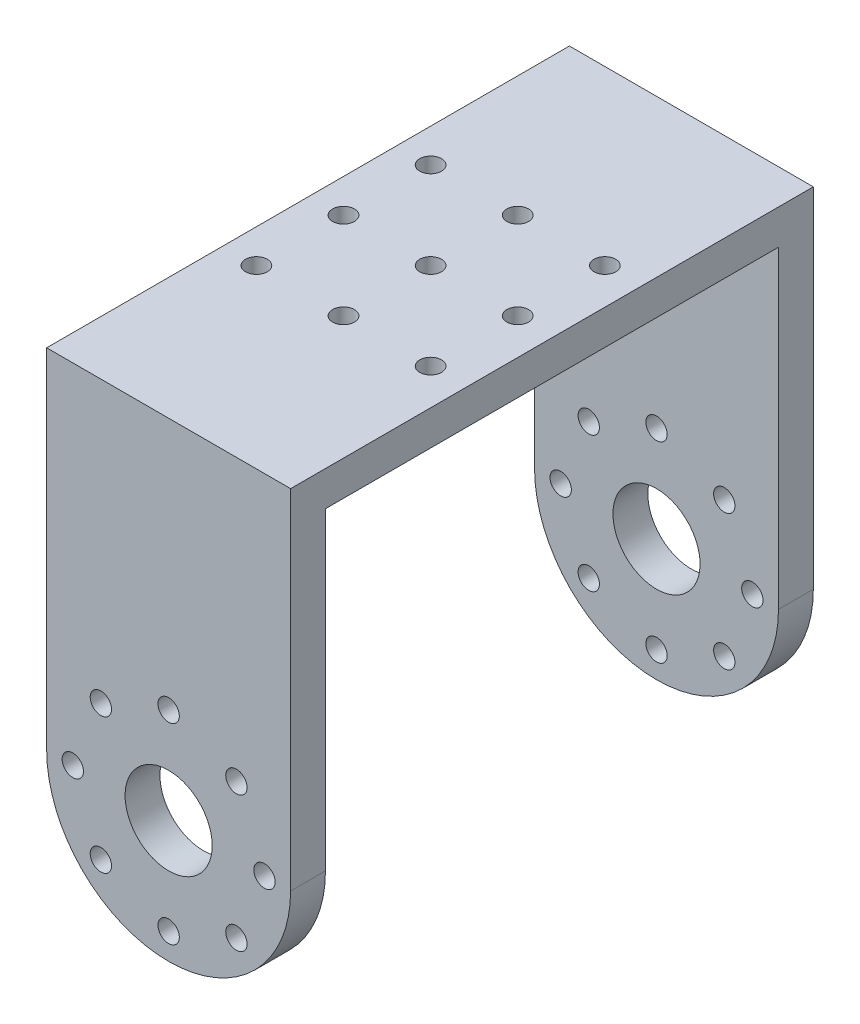
ISO-10303-21;
HEADER;
FILE_DESCRIPTION(('STEP AP214'),'2;1');
FILE_NAME('part.step','',(''),(''),'','','');
FILE_SCHEMA(('AUTOMOTIVE_DESIGN { 1 0 10303 214 1 1 1 1 }'));
ENDSEC;
DATA;
#1=APPLICATION_CONTEXT('core data for automotive mechanical design processes');
#2=APPLICATION_PROTOCOL_DEFINITION('international standard','automotive_design',2000,#1);
#3=PRODUCT_CONTEXT('',#1,'mechanical');
#4=PRODUCT('Part','Part','',(#3));
#5=PRODUCT_RELATED_PRODUCT_CATEGORY('part','',(#4));
#6=PRODUCT_DEFINITION_FORMATION('','',#4);
#7=PRODUCT_DEFINITION_CONTEXT('part definition',#1,'design');
#8=PRODUCT_DEFINITION('design','',#6,#7);
#9=PRODUCT_DEFINITION_SHAPE('','',#8);
#10=(LENGTH_UNIT() NAMED_UNIT(*) SI_UNIT(.MILLI.,.METRE.));
#11=(NAMED_UNIT(*) PLANE_ANGLE_UNIT() SI_UNIT($,.RADIAN.));
#12=(NAMED_UNIT(*) SI_UNIT($,.STERADIAN.) SOLID_ANGLE_UNIT());
#13=UNCERTAINTY_MEASURE_WITH_UNIT(LENGTH_MEASURE(1.E-05),#10,'distance_accuracy_value','');
#14=(GEOMETRIC_REPRESENTATION_CONTEXT(3) GLOBAL_UNCERTAINTY_ASSIGNED_CONTEXT((#13)) GLOBAL_UNIT_ASSIGNED_CONTEXT((#10,
#11,#12)) REPRESENTATION_CONTEXT('',''));
#15=CARTESIAN_POINT('',(0.,0.,0.));
#16=DIRECTION('',(0.,0.,1.));
#17=DIRECTION('',(1.,0.,0.));
#18=AXIS2_PLACEMENT_3D('',#15,#16,#17);
#19=CARTESIAN_POINT('',(0.,0.,60.));
#20=DIRECTION('',(0.,0.,-1.));
#21=DIRECTION('',(-1.,0.,0.));
#22=AXIS2_PLACEMENT_3D('',#19,#20,#21);
#23=CYLINDRICAL_SURFACE('',#22,14.);
#24=CARTESIAN_POINT('',(0.,0.,56.));
#25=DIRECTION('',(0.,0.,1.));
#26=DIRECTION('',(0.,-1.,0.));
#27=AXIS2_PLACEMENT_3D('',#24,#25,#26);
#28=CIRCLE('',#27,14.);
#29=CARTESIAN_POINT('',(-14.,0.,56.));
#30=VERTEX_POINT('',#29);
#31=CARTESIAN_POINT('',(14.,0.,56.));
#32=VERTEX_POINT('',#31);
#33=EDGE_CURVE('E187',#30,#32,#28,.T.);
#34=ORIENTED_EDGE('',*,*,#33,.T.);
#35=DIRECTION('',(0.,0.,-1.));
#36=VECTOR('',#35,1.);
#37=CARTESIAN_POINT('',(14.,0.,60.));
#38=LINE('',#37,#36);
#39=CARTESIAN_POINT('',(14.,0.,60.));
#40=VERTEX_POINT('',#39);
#41=EDGE_CURVE('E42',#40,#32,#38,.T.);
#42=ORIENTED_EDGE('',*,*,#41,.F.);
#43=CARTESIAN_POINT('',(0.,0.,60.));
#44=DIRECTION('',(0.,0.,1.));
#45=DIRECTION('',(1.,0.,0.));
#46=AXIS2_PLACEMENT_3D('',#43,#44,#45);
#47=CIRCLE('',#46,14.);
#48=CARTESIAN_POINT('',(-14.,0.,60.));
#49=VERTEX_POINT('',#48);
#50=EDGE_CURVE('E244',#49,#40,#47,.T.);
#51=ORIENTED_EDGE('',*,*,#50,.F.);
#52=DIRECTION('',(0.,0.,-1.));
#53=VECTOR('',#52,1.);
#54=CARTESIAN_POINT('',(-14.,0.,60.));
#55=LINE('',#54,#53);
#56=EDGE_CURVE('E257',#49,#30,#55,.T.);
#57=ORIENTED_EDGE('',*,*,#56,.T.);
#58=EDGE_LOOP('',(#34,#42,#51,#57));
#59=FACE_BOUND('',#58,.T.);
#60=ADVANCED_FACE('F33',(#59),#23,.T.);
#61=CARTESIAN_POINT('',(0.,0.,60.));
#62=DIRECTION('',(0.,0.,-1.));
#63=DIRECTION('',(-1.,0.,0.));
#64=AXIS2_PLACEMENT_3D('',#61,#62,#63);
#65=CYLINDRICAL_SURFACE('',#64,5.);
#66=CARTESIAN_POINT('',(0.,0.,56.));
#67=DIRECTION('',(0.,0.,1.));
#68=DIRECTION('',(0.,-1.,0.));
#69=AXIS2_PLACEMENT_3D('',#66,#67,#68);
#70=CIRCLE('',#69,5.);
#71=CARTESIAN_POINT('',(0.,-5.,56.));
#72=VERTEX_POINT('',#71);
#73=EDGE_CURVE('E181',#72,#72,#70,.T.);
#74=ORIENTED_EDGE('',*,*,#73,.F.);
#75=EDGE_LOOP('',(#74));
#76=FACE_BOUND('',#75,.T.);
#77=CARTESIAN_POINT('',(0.,0.,60.));
#78=DIRECTION('',(0.,0.,1.));
#79=DIRECTION('',(1.,0.,0.));
#80=AXIS2_PLACEMENT_3D('',#77,#78,#79);
#81=CIRCLE('',#80,5.);
#82=CARTESIAN_POINT('',(5.,0.,60.));
#83=VERTEX_POINT('',#82);
#84=EDGE_CURVE('E238',#83,#83,#81,.T.);
#85=ORIENTED_EDGE('',*,*,#84,.T.);
#86=EDGE_LOOP('',(#85));
#87=FACE_BOUND('',#86,.T.);
#88=ADVANCED_FACE('F376',(#76,#87),#65,.F.);
#89=CARTESIAN_POINT('',(0.,11.,60.));
#90=DIRECTION('',(0.,0.,-1.));
#91=DIRECTION('',(-1.,0.,0.));
#92=AXIS2_PLACEMENT_3D('',#89,#90,#91);
#93=CYLINDRICAL_SURFACE('',#92,1.22499999999995);
#94=CARTESIAN_POINT('',(0.,11.,56.));
#95=DIRECTION('',(0.,0.,1.));
#96=DIRECTION('',(0.,-1.,0.));
#97=AXIS2_PLACEMENT_3D('',#94,#95,#96);
#98=CIRCLE('',#97,1.22499999999995);
#99=CARTESIAN_POINT('',(0.,9.77500000000005,56.));
#100=VERTEX_POINT('',#99);
#101=EDGE_CURVE('E178',#100,#100,#98,.T.);
#102=ORIENTED_EDGE('',*,*,#101,.F.);
#103=EDGE_LOOP('',(#102));
#104=FACE_BOUND('',#103,.T.);
#105=CARTESIAN_POINT('',(0.,11.,60.));
#106=DIRECTION('',(0.,0.,1.));
#107=DIRECTION('',(1.,0.,0.));
#108=AXIS2_PLACEMENT_3D('',#105,#106,#107);
#109=CIRCLE('',#108,1.22499999999995);
#110=CARTESIAN_POINT('',(1.22499999999995,11.,60.));
#111=VERTEX_POINT('',#110);
#112=EDGE_CURVE('E232',#111,#111,#109,.T.);
#113=ORIENTED_EDGE('',*,*,#112,.T.);
#114=EDGE_LOOP('',(#113));
#115=FACE_BOUND('',#114,.T.);
#116=ADVANCED_FACE('F380',(#104,#115),#93,.F.);
#117=CARTESIAN_POINT('',(7.778174593052,7.778174593052,60.));
#118=DIRECTION('',(0.,0.,-1.));
#119=DIRECTION('',(-1.,0.,0.));
#120=AXIS2_PLACEMENT_3D('',#117,#118,#119);
#121=CYLINDRICAL_SURFACE('',#120,1.22499999999995);
#122=CARTESIAN_POINT('',(7.778174593052,7.778174593052,56.));
#123=DIRECTION('',(0.,0.,1.));
#124=DIRECTION('',(0.,-1.,0.));
#125=AXIS2_PLACEMENT_3D('',#122,#123,#124);
#126=CIRCLE('',#125,1.22499999999995);
#127=CARTESIAN_POINT('',(7.778174593052,6.55317459305205,56.));
#128=VERTEX_POINT('',#127);
#129=EDGE_CURVE('E175',#128,#128,#126,.T.);
#130=ORIENTED_EDGE('',*,*,#129,.F.);
#131=EDGE_LOOP('',(#130));
#132=FACE_BOUND('',#131,.T.);
#133=CARTESIAN_POINT('',(7.778174593052,7.778174593052,60.));
#134=DIRECTION('',(0.,0.,1.));
#135=DIRECTION('',(1.,0.,0.));
#136=AXIS2_PLACEMENT_3D('',#133,#134,#135);
#137=CIRCLE('',#136,1.22499999999995);
#138=CARTESIAN_POINT('',(9.00317459305195,7.778174593052,60.));
#139=VERTEX_POINT('',#138);
#140=EDGE_CURVE('E226',#139,#139,#137,.T.);
#141=ORIENTED_EDGE('',*,*,#140,.T.);
#142=EDGE_LOOP('',(#141));
#143=FACE_BOUND('',#142,.T.);
#144=ADVANCED_FACE('F490',(#132,#143),#121,.F.);
#145=CARTESIAN_POINT('',(11.,0.,60.));
#146=DIRECTION('',(0.,0.,-1.));
#147=DIRECTION('',(-1.,0.,0.));
#148=AXIS2_PLACEMENT_3D('',#145,#146,#147);
#149=CYLINDRICAL_SURFACE('',#148,1.22499999999995);
#150=CARTESIAN_POINT('',(11.,0.,56.));
#151=DIRECTION('',(0.,0.,1.));
#152=DIRECTION('',(0.,-1.,0.));
#153=AXIS2_PLACEMENT_3D('',#150,#151,#152);
#154=CIRCLE('',#153,1.22499999999995);
#155=CARTESIAN_POINT('',(11.,-1.22499999999995,56.));
#156=VERTEX_POINT('',#155);
#157=EDGE_CURVE('E172',#156,#156,#154,.T.);
#158=ORIENTED_EDGE('',*,*,#157,.F.);
#159=EDGE_LOOP('',(#158));
#160=FACE_BOUND('',#159,.T.);
#161=CARTESIAN_POINT('',(11.,0.,60.));
#162=DIRECTION('',(0.,0.,1.));
#163=DIRECTION('',(1.,0.,0.));
#164=AXIS2_PLACEMENT_3D('',#161,#162,#163);
#165=CIRCLE('',#164,1.22499999999995);
#166=CARTESIAN_POINT('',(12.225,0.,60.));
#167=VERTEX_POINT('',#166);
#168=EDGE_CURVE('E220',#167,#167,#165,.T.);
#169=ORIENTED_EDGE('',*,*,#168,.T.);
#170=EDGE_LOOP('',(#169));
#171=FACE_BOUND('',#170,.T.);
#172=ADVANCED_FACE('F485',(#160,#171),#149,.F.);
#173=CARTESIAN_POINT('',(7.778174593052,-7.778174593052,60.));
#174=DIRECTION('',(0.,0.,-1.));
#175=DIRECTION('',(-1.,0.,0.));
#176=AXIS2_PLACEMENT_3D('',#173,#174,#175);
#177=CYLINDRICAL_SURFACE('',#176,1.22499999999996);
#178=CARTESIAN_POINT('',(7.778174593052,-7.778174593052,56.));
#179=DIRECTION('',(0.,0.,1.));
#180=DIRECTION('',(0.,-1.,0.));
#181=AXIS2_PLACEMENT_3D('',#178,#179,#180);
#182=CIRCLE('',#181,1.22499999999996);
#183=CARTESIAN_POINT('',(7.778174593052,-9.00317459305196,56.));
#184=VERTEX_POINT('',#183);
#185=EDGE_CURVE('E169',#184,#184,#182,.T.);
#186=ORIENTED_EDGE('',*,*,#185,.F.);
#187=EDGE_LOOP('',(#186));
#188=FACE_BOUND('',#187,.T.);
#189=CARTESIAN_POINT('',(7.778174593052,-7.778174593052,60.));
#190=DIRECTION('',(0.,0.,1.));
#191=DIRECTION('',(1.,0.,0.));
#192=AXIS2_PLACEMENT_3D('',#189,#190,#191);
#193=CIRCLE('',#192,1.22499999999996);
#194=CARTESIAN_POINT('',(9.00317459305196,-7.778174593052,60.));
#195=VERTEX_POINT('',#194);
#196=EDGE_CURVE('E214',#195,#195,#193,.T.);
#197=ORIENTED_EDGE('',*,*,#196,.T.);
#198=EDGE_LOOP('',(#197));
#199=FACE_BOUND('',#198,.T.);
#200=ADVANCED_FACE('F480',(#188,#199),#177,.F.);
#201=CARTESIAN_POINT('',(0.,-11.,60.));
#202=DIRECTION('',(0.,0.,-1.));
#203=DIRECTION('',(-1.,0.,0.));
#204=AXIS2_PLACEMENT_3D('',#201,#202,#203);
#205=CYLINDRICAL_SURFACE('',#204,1.22499999999995);
#206=CARTESIAN_POINT('',(0.,-11.,56.));
#207=DIRECTION('',(0.,0.,1.));
#208=DIRECTION('',(0.,-1.,0.));
#209=AXIS2_PLACEMENT_3D('',#206,#207,#208);
#210=CIRCLE('',#209,1.22499999999995);
#211=CARTESIAN_POINT('',(0.,-12.225,56.));
#212=VERTEX_POINT('',#211);
#213=EDGE_CURVE('E166',#212,#212,#210,.T.);
#214=ORIENTED_EDGE('',*,*,#213,.F.);
#215=EDGE_LOOP('',(#214));
#216=FACE_BOUND('',#215,.T.);
#217=CARTESIAN_POINT('',(0.,-11.,60.));
#218=DIRECTION('',(0.,0.,1.));
#219=DIRECTION('',(1.,0.,0.));
#220=AXIS2_PLACEMENT_3D('',#217,#218,#219);
#221=CIRCLE('',#220,1.22499999999995);
#222=CARTESIAN_POINT('',(1.22499999999995,-11.,60.));
#223=VERTEX_POINT('',#222);
#224=EDGE_CURVE('E208',#223,#223,#221,.T.);
#225=ORIENTED_EDGE('',*,*,#224,.T.);
#226=EDGE_LOOP('',(#225));
#227=FACE_BOUND('',#226,.T.);
#228=ADVANCED_FACE('F475',(#216,#227),#205,.F.);
#229=CARTESIAN_POINT('',(-7.778174593052,-7.778174593052,60.));
#230=DIRECTION('',(0.,0.,-1.));
#231=DIRECTION('',(-1.,0.,0.));
#232=AXIS2_PLACEMENT_3D('',#229,#230,#231);
#233=CYLINDRICAL_SURFACE('',#232,1.22499999999996);
#234=CARTESIAN_POINT('',(-7.778174593052,-7.778174593052,56.));
#235=DIRECTION('',(0.,0.,1.));
#236=DIRECTION('',(0.,-1.,0.));
#237=AXIS2_PLACEMENT_3D('',#234,#235,#236);
#238=CIRCLE('',#237,1.22499999999996);
#239=CARTESIAN_POINT('',(-7.778174593052,-9.00317459305196,56.));
#240=VERTEX_POINT('',#239);
#241=EDGE_CURVE('E163',#240,#240,#238,.T.);
#242=ORIENTED_EDGE('',*,*,#241,.F.);
#243=EDGE_LOOP('',(#242));
#244=FACE_BOUND('',#243,.T.);
#245=CARTESIAN_POINT('',(-7.778174593052,-7.778174593052,60.));
#246=DIRECTION('',(0.,0.,1.));
#247=DIRECTION('',(1.,0.,0.));
#248=AXIS2_PLACEMENT_3D('',#245,#246,#247);
#249=CIRCLE('',#248,1.22499999999996);
#250=CARTESIAN_POINT('',(-6.55317459305204,-7.778174593052,60.));
#251=VERTEX_POINT('',#250);
#252=EDGE_CURVE('E202',#251,#251,#249,.T.);
#253=ORIENTED_EDGE('',*,*,#252,.T.);
#254=EDGE_LOOP('',(#253));
#255=FACE_BOUND('',#254,.T.);
#256=ADVANCED_FACE('F367',(#244,#255),#233,.F.);
#257=CARTESIAN_POINT('',(-11.,0.,60.));
#258=DIRECTION('',(0.,0.,-1.));
#259=DIRECTION('',(-1.,0.,0.));
#260=AXIS2_PLACEMENT_3D('',#257,#258,#259);
#261=CYLINDRICAL_SURFACE('',#260,1.22499999999995);
#262=CARTESIAN_POINT('',(-11.,0.,56.));
#263=DIRECTION('',(0.,0.,1.));
#264=DIRECTION('',(0.,-1.,0.));
#265=AXIS2_PLACEMENT_3D('',#262,#263,#264);
#266=CIRCLE('',#265,1.22499999999995);
#267=CARTESIAN_POINT('',(-11.,-1.22499999999995,56.));
#268=VERTEX_POINT('',#267);
#269=EDGE_CURVE('E160',#268,#268,#266,.T.);
#270=ORIENTED_EDGE('',*,*,#269,.F.);
#271=EDGE_LOOP('',(#270));
#272=FACE_BOUND('',#271,.T.);
#273=CARTESIAN_POINT('',(-11.,0.,60.));
#274=DIRECTION('',(0.,0.,1.));
#275=DIRECTION('',(1.,0.,0.));
#276=AXIS2_PLACEMENT_3D('',#273,#274,#275);
#277=CIRCLE('',#276,1.22499999999995);
#278=CARTESIAN_POINT('',(-9.77500000000005,0.,60.));
#279=VERTEX_POINT('',#278);
#280=EDGE_CURVE('E196',#279,#279,#277,.T.);
#281=ORIENTED_EDGE('',*,*,#280,.T.);
#282=EDGE_LOOP('',(#281));
#283=FACE_BOUND('',#282,.T.);
#284=ADVANCED_FACE('F360',(#272,#283),#261,.F.);
#285=CARTESIAN_POINT('',(-7.778174593052,7.778174593052,60.));
#286=DIRECTION('',(0.,0.,-1.));
#287=DIRECTION('',(-1.,0.,0.));
#288=AXIS2_PLACEMENT_3D('',#285,#286,#287);
#289=CYLINDRICAL_SURFACE('',#288,1.22499999999995);
#290=CARTESIAN_POINT('',(-7.778174593052,7.778174593052,56.));
#291=DIRECTION('',(0.,0.,1.));
#292=DIRECTION('',(0.,-1.,0.));
#293=AXIS2_PLACEMENT_3D('',#290,#291,#292);
#294=CIRCLE('',#293,1.22499999999995);
#295=CARTESIAN_POINT('',(-7.778174593052,6.55317459305205,56.));
#296=VERTEX_POINT('',#295);
#297=EDGE_CURVE('E159',#296,#296,#294,.T.);
#298=ORIENTED_EDGE('',*,*,#297,.F.);
#299=EDGE_LOOP('',(#298));
#300=FACE_BOUND('',#299,.T.);
#301=CARTESIAN_POINT('',(-7.778174593052,7.778174593052,60.));
#302=DIRECTION('',(0.,0.,1.));
#303=DIRECTION('',(1.,0.,0.));
#304=AXIS2_PLACEMENT_3D('',#301,#302,#303);
#305=CIRCLE('',#304,1.22499999999995);
#306=CARTESIAN_POINT('',(-6.55317459305205,7.778174593052,60.));
#307=VERTEX_POINT('',#306);
#308=EDGE_CURVE('E190',#307,#307,#305,.T.);
#309=ORIENTED_EDGE('',*,*,#308,.T.);
#310=EDGE_LOOP('',(#309));
#311=FACE_BOUND('',#310,.T.);
#312=ADVANCED_FACE('F346',(#300,#311),#289,.F.);
#313=CARTESIAN_POINT('',(0.,0.,60.));
#314=DIRECTION('',(0.,0.,1.));
#315=DIRECTION('',(1.,0.,0.));
#316=AXIS2_PLACEMENT_3D('',#313,#314,#315);
#317=PLANE('',#316);
#318=ORIENTED_EDGE('',*,*,#280,.F.);
#319=EDGE_LOOP('',(#318));
#320=FACE_BOUND('',#319,.T.);
#321=ORIENTED_EDGE('',*,*,#224,.F.);
#322=EDGE_LOOP('',(#321));
#323=FACE_BOUND('',#322,.T.);
#324=ORIENTED_EDGE('',*,*,#168,.F.);
#325=EDGE_LOOP('',(#324));
#326=FACE_BOUND('',#325,.T.);
#327=ORIENTED_EDGE('',*,*,#112,.F.);
#328=EDGE_LOOP('',(#327));
#329=FACE_BOUND('',#328,.T.);
#330=ORIENTED_EDGE('',*,*,#50,.T.);
#331=DIRECTION('',(0.,1.,0.));
#332=VECTOR('',#331,1.);
#333=CARTESIAN_POINT('',(14.,0.,60.));
#334=LINE('',#333,#332);
#335=CARTESIAN_POINT('',(14.,40.,60.));
#336=VERTEX_POINT('',#335);
#337=EDGE_CURVE('E89',#40,#336,#334,.T.);
#338=ORIENTED_EDGE('',*,*,#337,.T.);
#339=DIRECTION('',(-1.,0.,0.));
#340=VECTOR('',#339,1.);
#341=CARTESIAN_POINT('',(-14.,40.,60.));
#342=LINE('',#341,#340);
#343=CARTESIAN_POINT('',(-14.,40.,60.));
#344=VERTEX_POINT('',#343);
#345=EDGE_CURVE('E248',#336,#344,#342,.T.);
#346=ORIENTED_EDGE('',*,*,#345,.T.);
#347=DIRECTION('',(0.,-1.,0.));
#348=VECTOR('',#347,1.);
#349=CARTESIAN_POINT('',(-14.,0.,60.));
#350=LINE('',#349,#348);
#351=EDGE_CURVE('E59',#344,#49,#350,.T.);
#352=ORIENTED_EDGE('',*,*,#351,.T.);
#353=EDGE_LOOP('',(#330,#338,#346,#352));
#354=FACE_BOUND('',#353,.T.);
#355=ORIENTED_EDGE('',*,*,#84,.F.);
#356=EDGE_LOOP('',(#355));
#357=FACE_BOUND('',#356,.T.);
#358=ORIENTED_EDGE('',*,*,#140,.F.);
#359=EDGE_LOOP('',(#358));
#360=FACE_BOUND('',#359,.T.);
#361=ORIENTED_EDGE('',*,*,#196,.F.);
#362=EDGE_LOOP('',(#361));
#363=FACE_BOUND('',#362,.T.);
#364=ORIENTED_EDGE('',*,*,#252,.F.);
#365=EDGE_LOOP('',(#364));
#366=FACE_BOUND('',#365,.T.);
#367=ORIENTED_EDGE('',*,*,#308,.F.);
#368=EDGE_LOOP('',(#367));
#369=FACE_BOUND('',#368,.T.);
#370=ADVANCED_FACE('F343',(#320,#323,#326,#329,#354,#357,#360,#363,#366,#369),#317,.T.);
#371=CARTESIAN_POINT('',(0.,0.,0.));
#372=DIRECTION('',(0.,0.,1.));
#373=DIRECTION('',(1.,0.,0.));
#374=AXIS2_PLACEMENT_3D('',#371,#372,#373);
#375=PLANE('',#374);
#376=CARTESIAN_POINT('',(-11.,0.,0.));
#377=DIRECTION('',(0.,0.,1.));
#378=DIRECTION('',(1.,0.,0.));
#379=AXIS2_PLACEMENT_3D('',#376,#377,#378);
#380=CIRCLE('',#379,1.22499999999995);
#381=CARTESIAN_POINT('',(-9.77500000000005,0.,0.));
#382=VERTEX_POINT('',#381);
#383=EDGE_CURVE('E193',#382,#382,#380,.T.);
#384=ORIENTED_EDGE('',*,*,#383,.T.);
#385=EDGE_LOOP('',(#384));
#386=FACE_BOUND('',#385,.T.);
#387=CARTESIAN_POINT('',(0.,-11.,0.));
#388=DIRECTION('',(0.,0.,1.));
#389=DIRECTION('',(1.,0.,0.));
#390=AXIS2_PLACEMENT_3D('',#387,#388,#389);
#391=CIRCLE('',#390,1.22499999999995);
#392=CARTESIAN_POINT('',(1.22499999999995,-11.,0.));
#393=VERTEX_POINT('',#392);
#394=EDGE_CURVE('E205',#393,#393,#391,.T.);
#395=ORIENTED_EDGE('',*,*,#394,.T.);
#396=EDGE_LOOP('',(#395));
#397=FACE_BOUND('',#396,.T.);
#398=CARTESIAN_POINT('',(11.,0.,0.));
#399=DIRECTION('',(0.,0.,1.));
#400=DIRECTION('',(1.,0.,0.));
#401=AXIS2_PLACEMENT_3D('',#398,#399,#400);
#402=CIRCLE('',#401,1.22499999999995);
#403=CARTESIAN_POINT('',(12.225,0.,0.));
#404=VERTEX_POINT('',#403);
#405=EDGE_CURVE('E217',#404,#404,#402,.T.);
#406=ORIENTED_EDGE('',*,*,#405,.T.);
#407=EDGE_LOOP('',(#406));
#408=FACE_BOUND('',#407,.T.);
#409=CARTESIAN_POINT('',(0.,11.,0.));
#410=DIRECTION('',(0.,0.,1.));
#411=DIRECTION('',(1.,0.,0.));
#412=AXIS2_PLACEMENT_3D('',#409,#410,#411);
#413=CIRCLE('',#412,1.22499999999995);
#414=CARTESIAN_POINT('',(1.22499999999995,11.,0.));
#415=VERTEX_POINT('',#414);
#416=EDGE_CURVE('E229',#415,#415,#413,.T.);
#417=ORIENTED_EDGE('',*,*,#416,.T.);
#418=EDGE_LOOP('',(#417));
#419=FACE_BOUND('',#418,.T.);
#420=CARTESIAN_POINT('',(0.,0.,0.));
#421=DIRECTION('',(0.,0.,1.));
#422=DIRECTION('',(1.,0.,0.));
#423=AXIS2_PLACEMENT_3D('',#420,#421,#422);
#424=CIRCLE('',#423,14.);
#425=CARTESIAN_POINT('',(-14.,0.,0.));
#426=VERTEX_POINT('',#425);
#427=CARTESIAN_POINT('',(14.,0.,0.));
#428=VERTEX_POINT('',#427);
#429=EDGE_CURVE('E241',#426,#428,#424,.T.);
#430=ORIENTED_EDGE('',*,*,#429,.F.);
#431=DIRECTION('',(0.,-1.,0.));
#432=VECTOR('',#431,1.);
#433=CARTESIAN_POINT('',(-14.,0.,0.));
#434=LINE('',#433,#432);
#435=CARTESIAN_POINT('',(-14.,40.,0.));
#436=VERTEX_POINT('',#435);
#437=EDGE_CURVE('E246',#436,#426,#434,.T.);
#438=ORIENTED_EDGE('',*,*,#437,.F.);
#439=DIRECTION('',(-1.,0.,0.));
#440=VECTOR('',#439,1.);
#441=CARTESIAN_POINT('',(-14.,40.,0.));
#442=LINE('',#441,#440);
#443=CARTESIAN_POINT('',(14.,40.,0.));
#444=VERTEX_POINT('',#443);
#445=EDGE_CURVE('E254',#444,#436,#442,.T.);
#446=ORIENTED_EDGE('',*,*,#445,.F.);
#447=DIRECTION('',(0.,1.,0.));
#448=VECTOR('',#447,1.);
#449=CARTESIAN_POINT('',(14.,0.,0.));
#450=LINE('',#449,#448);
#451=EDGE_CURVE('E252',#428,#444,#450,.T.);
#452=ORIENTED_EDGE('',*,*,#451,.F.);
#453=EDGE_LOOP('',(#430,#438,#446,#452));
#454=FACE_BOUND('',#453,.T.);
#455=CARTESIAN_POINT('',(0.,0.,0.));
#456=DIRECTION('',(0.,0.,1.));
#457=DIRECTION('',(1.,0.,0.));
#458=AXIS2_PLACEMENT_3D('',#455,#456,#457);
#459=CIRCLE('',#458,5.);
#460=CARTESIAN_POINT('',(5.,0.,0.));
#461=VERTEX_POINT('',#460);
#462=EDGE_CURVE('E235',#461,#461,#459,.T.);
#463=ORIENTED_EDGE('',*,*,#462,.T.);
#464=EDGE_LOOP('',(#463));
#465=FACE_BOUND('',#464,.T.);
#466=CARTESIAN_POINT('',(7.778174593052,7.778174593052,0.));
#467=DIRECTION('',(0.,0.,1.));
#468=DIRECTION('',(1.,0.,0.));
#469=AXIS2_PLACEMENT_3D('',#466,#467,#468);
#470=CIRCLE('',#469,1.22499999999995);
#471=CARTESIAN_POINT('',(9.00317459305195,7.778174593052,0.));
#472=VERTEX_POINT('',#471);
#473=EDGE_CURVE('E223',#472,#472,#470,.T.);
#474=ORIENTED_EDGE('',*,*,#473,.T.);
#475=EDGE_LOOP('',(#474));
#476=FACE_BOUND('',#475,.T.);
#477=CARTESIAN_POINT('',(7.778174593052,-7.778174593052,0.));
#478=DIRECTION('',(0.,0.,1.));
#479=DIRECTION('',(1.,0.,0.));
#480=AXIS2_PLACEMENT_3D('',#477,#478,#479);
#481=CIRCLE('',#480,1.22499999999996);
#482=CARTESIAN_POINT('',(9.00317459305196,-7.778174593052,0.));
#483=VERTEX_POINT('',#482);
#484=EDGE_CURVE('E211',#483,#483,#481,.T.);
#485=ORIENTED_EDGE('',*,*,#484,.T.);
#486=EDGE_LOOP('',(#485));
#487=FACE_BOUND('',#486,.T.);
#488=CARTESIAN_POINT('',(-7.778174593052,-7.778174593052,0.));
#489=DIRECTION('',(0.,0.,1.));
#490=DIRECTION('',(1.,0.,0.));
#491=AXIS2_PLACEMENT_3D('',#488,#489,#490);
#492=CIRCLE('',#491,1.22499999999996);
#493=CARTESIAN_POINT('',(-6.55317459305204,-7.778174593052,0.));
#494=VERTEX_POINT('',#493);
#495=EDGE_CURVE('E199',#494,#494,#492,.T.);
#496=ORIENTED_EDGE('',*,*,#495,.T.);
#497=EDGE_LOOP('',(#496));
#498=FACE_BOUND('',#497,.T.);
#499=CARTESIAN_POINT('',(-7.778174593052,7.778174593052,0.));
#500=DIRECTION('',(0.,0.,1.));
#501=DIRECTION('',(1.,0.,0.));
#502=AXIS2_PLACEMENT_3D('',#499,#500,#501);
#503=CIRCLE('',#502,1.22499999999995);
#504=CARTESIAN_POINT('',(-6.55317459305205,7.778174593052,0.));
#505=VERTEX_POINT('',#504);
#506=EDGE_CURVE('E189',#505,#505,#503,.T.);
#507=ORIENTED_EDGE('',*,*,#506,.T.);
#508=EDGE_LOOP('',(#507));
#509=FACE_BOUND('',#508,.T.);
#510=ADVANCED_FACE('F338',(#386,#397,#408,#419,#454,#465,#476,#487,#498,#509),#375,.F.);
#511=CARTESIAN_POINT('',(14.,0.,4.));
#512=VERTEX_POINT('',#511);
#513=EDGE_CURVE('E266',#512,#428,#38,.T.);
#514=ORIENTED_EDGE('',*,*,#513,.F.);
#515=CARTESIAN_POINT('',(0.,0.,4.));
#516=DIRECTION('',(0.,0.,-1.));
#517=DIRECTION('',(0.,1.,0.));
#518=AXIS2_PLACEMENT_3D('',#515,#516,#517);
#519=CIRCLE('',#518,14.);
#520=CARTESIAN_POINT('',(-14.,0.,4.));
#521=VERTEX_POINT('',#520);
#522=EDGE_CURVE('E121',#512,#521,#519,.T.);
#523=ORIENTED_EDGE('',*,*,#522,.T.);
#524=EDGE_CURVE('E81',#521,#426,#55,.T.);
#525=ORIENTED_EDGE('',*,*,#524,.T.);
#526=ORIENTED_EDGE('',*,*,#429,.T.);
#527=EDGE_LOOP('',(#514,#523,#525,#526));
#528=FACE_BOUND('',#527,.T.);
#529=ADVANCED_FACE('F35',(#528),#23,.T.);
#530=CARTESIAN_POINT('',(14.,0.,60.));
#531=DIRECTION('',(-1.,0.,0.));
#532=DIRECTION('',(0.,0.,1.));
#533=AXIS2_PLACEMENT_3D('',#530,#531,#532);
#534=PLANE('',#533);
#535=ORIENTED_EDGE('',*,*,#41,.T.);
#536=DIRECTION('',(0.,-1.,0.));
#537=VECTOR('',#536,1.);
#538=CARTESIAN_POINT('',(14.,36.,56.));
#539=LINE('',#538,#537);
#540=CARTESIAN_POINT('',(14.,36.,56.));
#541=VERTEX_POINT('',#540);
#542=EDGE_CURVE('E123',#541,#32,#539,.T.);
#543=ORIENTED_EDGE('',*,*,#542,.F.);
#544=DIRECTION('',(0.,0.,1.));
#545=VECTOR('',#544,1.);
#546=CARTESIAN_POINT('',(14.,36.,56.));
#547=LINE('',#546,#545);
#548=CARTESIAN_POINT('',(14.,36.,4.));
#549=VERTEX_POINT('',#548);
#550=EDGE_CURVE('E113',#549,#541,#547,.T.);
#551=ORIENTED_EDGE('',*,*,#550,.F.);
#552=DIRECTION('',(0.,1.,0.));
#553=VECTOR('',#552,1.);
#554=CARTESIAN_POINT('',(14.,36.,4.));
#555=LINE('',#554,#553);
#556=EDGE_CURVE('E119',#512,#549,#555,.T.);
#557=ORIENTED_EDGE('',*,*,#556,.F.);
#558=ORIENTED_EDGE('',*,*,#513,.T.);
#559=ORIENTED_EDGE('',*,*,#451,.T.);
#560=DIRECTION('',(0.,0.,-1.));
#561=VECTOR('',#560,1.);
#562=CARTESIAN_POINT('',(14.,40.,60.));
#563=LINE('',#562,#561);
#564=EDGE_CURVE('E263',#336,#444,#563,.T.);
#565=ORIENTED_EDGE('',*,*,#564,.F.);
#566=ORIENTED_EDGE('',*,*,#337,.F.);
#567=EDGE_LOOP('',(#535,#543,#551,#557,#558,#559,#565,#566));
#568=FACE_BOUND('',#567,.T.);
#569=ADVANCED_FACE('F125',(#568),#534,.F.);
#570=CARTESIAN_POINT('',(-14.,40.,60.));
#571=DIRECTION('',(0.,-1.,0.));
#572=DIRECTION('',(0.,0.,-1.));
#573=AXIS2_PLACEMENT_3D('',#570,#571,#572);
#574=PLANE('',#573);
#575=CARTESIAN_POINT('',(9.85727232101841,40.,39.7863070079322));
#576=DIRECTION('',(0.,1.,0.));
#577=DIRECTION('',(0.,0.,1.));
#578=AXIS2_PLACEMENT_3D('',#575,#576,#577);
#579=CIRCLE('',#578,1.25);
#580=CARTESIAN_POINT('',(9.85727232101841,40.,41.0363070079322));
#581=VERTEX_POINT('',#580);
#582=EDGE_CURVE('E311',#581,#581,#579,.T.);
#583=ORIENTED_EDGE('',*,*,#582,.F.);
#584=EDGE_LOOP('',(#583));
#585=FACE_BOUND('',#584,.T.);
#586=CARTESIAN_POINT('',(9.8572723210183,40.,29.7863070079327));
#587=DIRECTION('',(0.,1.,0.));
#588=DIRECTION('',(0.,0.,1.));
#589=AXIS2_PLACEMENT_3D('',#586,#587,#588);
#590=CIRCLE('',#589,1.25000000000016);
#591=CARTESIAN_POINT('',(9.8572723210183,40.,31.0363070079329));
#592=VERTEX_POINT('',#591);
#593=EDGE_CURVE('E301',#592,#592,#590,.T.);
#594=ORIENTED_EDGE('',*,*,#593,.F.);
#595=EDGE_LOOP('',(#594));
#596=FACE_BOUND('',#595,.T.);
#597=CARTESIAN_POINT('',(9.85727232101827,40.,19.7863070079322));
#598=DIRECTION('',(0.,1.,0.));
#599=DIRECTION('',(0.,0.,1.));
#600=AXIS2_PLACEMENT_3D('',#597,#598,#599);
#601=CIRCLE('',#600,1.25);
#602=CARTESIAN_POINT('',(9.85727232101827,40.,21.0363070079322));
#603=VERTEX_POINT('',#602);
#604=EDGE_CURVE('E298',#603,#603,#601,.T.);
#605=ORIENTED_EDGE('',*,*,#604,.F.);
#606=EDGE_LOOP('',(#605));
#607=FACE_BOUND('',#606,.T.);
#608=CARTESIAN_POINT('',(-0.142727678981734,40.,19.7863070079323));
#609=DIRECTION('',(0.,1.,0.));
#610=DIRECTION('',(0.,0.,1.));
#611=AXIS2_PLACEMENT_3D('',#608,#609,#610);
#612=CIRCLE('',#611,1.25);
#613=CARTESIAN_POINT('',(-0.142727678981734,40.,21.0363070079323));
#614=VERTEX_POINT('',#613);
#615=EDGE_CURVE('E295',#614,#614,#612,.T.);
#616=ORIENTED_EDGE('',*,*,#615,.F.);
#617=EDGE_LOOP('',(#616));
#618=FACE_BOUND('',#617,.T.);
#619=CARTESIAN_POINT('',(-0.142727678981699,40.,29.7863070079323));
#620=DIRECTION('',(0.,1.,0.));
#621=DIRECTION('',(0.,0.,1.));
#622=AXIS2_PLACEMENT_3D('',#619,#620,#621);
#623=CIRCLE('',#622,1.25);
#624=CARTESIAN_POINT('',(-0.142727678981699,40.,31.0363070079323));
#625=VERTEX_POINT('',#624);
#626=EDGE_CURVE('E291',#625,#625,#623,.T.);
#627=ORIENTED_EDGE('',*,*,#626,.F.);
#628=EDGE_LOOP('',(#627));
#629=FACE_BOUND('',#628,.T.);
#630=CARTESIAN_POINT('',(-0.142727678981595,40.,39.7863070079323));
#631=DIRECTION('',(0.,1.,0.));
#632=DIRECTION('',(0.,0.,1.));
#633=AXIS2_PLACEMENT_3D('',#630,#631,#632);
#634=CIRCLE('',#633,1.25);
#635=CARTESIAN_POINT('',(-0.142727678981595,40.,41.0363070079323));
#636=VERTEX_POINT('',#635);
#637=EDGE_CURVE('E287',#636,#636,#634,.T.);
#638=ORIENTED_EDGE('',*,*,#637,.F.);
#639=EDGE_LOOP('',(#638));
#640=FACE_BOUND('',#639,.T.);
#641=CARTESIAN_POINT('',(-10.1427276789817,40.,29.7863070079325));
#642=DIRECTION('',(0.,1.,0.));
#643=DIRECTION('',(0.,0.,1.));
#644=AXIS2_PLACEMENT_3D('',#641,#642,#643);
#645=CIRCLE('',#644,1.25000000000005);
#646=CARTESIAN_POINT('',(-10.1427276789817,40.,31.0363070079326));
#647=VERTEX_POINT('',#646);
#648=EDGE_CURVE('E283',#647,#647,#645,.T.);
#649=ORIENTED_EDGE('',*,*,#648,.F.);
#650=EDGE_LOOP('',(#649));
#651=FACE_BOUND('',#650,.T.);
#652=CARTESIAN_POINT('',(-10.1427276789817,40.,19.7863070079324));
#653=DIRECTION('',(0.,1.,0.));
#654=DIRECTION('',(0.,0.,1.));
#655=AXIS2_PLACEMENT_3D('',#652,#653,#654);
#656=CIRCLE('',#655,1.25000000000001);
#657=CARTESIAN_POINT('',(-10.1427276789817,40.,21.0363070079324));
#658=VERTEX_POINT('',#657);
#659=EDGE_CURVE('E279',#658,#658,#656,.T.);
#660=ORIENTED_EDGE('',*,*,#659,.F.);
#661=EDGE_LOOP('',(#660));
#662=FACE_BOUND('',#661,.T.);
#663=CARTESIAN_POINT('',(-10.1427276789816,40.,39.7863070079324));
#664=DIRECTION('',(0.,1.,0.));
#665=DIRECTION('',(0.,0.,1.));
#666=AXIS2_PLACEMENT_3D('',#663,#664,#665);
#667=CIRCLE('',#666,1.25);
#668=CARTESIAN_POINT('',(-10.1427276789816,40.,41.0363070079324));
#669=VERTEX_POINT('',#668);
#670=EDGE_CURVE('E275',#669,#669,#667,.T.);
#671=ORIENTED_EDGE('',*,*,#670,.F.);
#672=EDGE_LOOP('',(#671));
#673=FACE_BOUND('',#672,.T.);
#674=ORIENTED_EDGE('',*,*,#445,.T.);
#675=DIRECTION('',(0.,0.,-1.));
#676=VECTOR('',#675,1.);
#677=CARTESIAN_POINT('',(-14.,40.,60.));
#678=LINE('',#677,#676);
#679=EDGE_CURVE('E260',#344,#436,#678,.T.);
#680=ORIENTED_EDGE('',*,*,#679,.F.);
#681=ORIENTED_EDGE('',*,*,#345,.F.);
#682=ORIENTED_EDGE('',*,*,#564,.T.);
#683=EDGE_LOOP('',(#674,#680,#681,#682));
#684=FACE_BOUND('',#683,.T.);
#685=ADVANCED_FACE('F342',(#585,#596,#607,#618,#629,#640,#651,#662,#673,#684),#574,.F.);
#686=CARTESIAN_POINT('',(-14.,0.,60.));
#687=DIRECTION('',(1.,0.,0.));
#688=DIRECTION('',(0.,0.,-1.));
#689=AXIS2_PLACEMENT_3D('',#686,#687,#688);
#690=PLANE('',#689);
#691=DIRECTION('',(0.,0.,1.));
#692=VECTOR('',#691,1.);
#693=CARTESIAN_POINT('',(-14.,36.,60.));
#694=LINE('',#693,#692);
#695=CARTESIAN_POINT('',(-14.,36.,4.));
#696=VERTEX_POINT('',#695);
#697=CARTESIAN_POINT('',(-14.,36.,56.));
#698=VERTEX_POINT('',#697);
#699=EDGE_CURVE('E11',#696,#698,#694,.T.);
#700=ORIENTED_EDGE('',*,*,#699,.T.);
#701=DIRECTION('',(0.,-1.,0.));
#702=VECTOR('',#701,1.);
#703=CARTESIAN_POINT('',(-14.,0.,56.));
#704=LINE('',#703,#702);
#705=EDGE_CURVE('E184',#698,#30,#704,.T.);
#706=ORIENTED_EDGE('',*,*,#705,.T.);
#707=ORIENTED_EDGE('',*,*,#56,.F.);
#708=ORIENTED_EDGE('',*,*,#351,.F.);
#709=ORIENTED_EDGE('',*,*,#679,.T.);
#710=ORIENTED_EDGE('',*,*,#437,.T.);
#711=ORIENTED_EDGE('',*,*,#524,.F.);
#712=DIRECTION('',(0.,1.,0.));
#713=VECTOR('',#712,1.);
#714=CARTESIAN_POINT('',(-14.,0.,4.));
#715=LINE('',#714,#713);
#716=EDGE_CURVE('E156',#521,#696,#715,.T.);
#717=ORIENTED_EDGE('',*,*,#716,.T.);
#718=EDGE_LOOP('',(#700,#706,#707,#708,#709,#710,#711,#717));
#719=FACE_BOUND('',#718,.T.);
#720=ADVANCED_FACE('F331',(#719),#690,.F.);
#721=CARTESIAN_POINT('',(0.,0.,4.));
#722=DIRECTION('',(0.,0.,-1.));
#723=DIRECTION('',(0.,1.,0.));
#724=AXIS2_PLACEMENT_3D('',#721,#722,#723);
#725=CIRCLE('',#724,5.);
#726=CARTESIAN_POINT('',(0.,5.,4.));
#727=VERTEX_POINT('',#726);
#728=EDGE_CURVE('E153',#727,#727,#725,.T.);
#729=ORIENTED_EDGE('',*,*,#728,.F.);
#730=EDGE_LOOP('',(#729));
#731=FACE_BOUND('',#730,.T.);
#732=ORIENTED_EDGE('',*,*,#462,.F.);
#733=EDGE_LOOP('',(#732));
#734=FACE_BOUND('',#733,.T.);
#735=ADVANCED_FACE('F383',(#731,#734),#65,.F.);
#736=CARTESIAN_POINT('',(0.,11.,4.));
#737=DIRECTION('',(0.,0.,-1.));
#738=DIRECTION('',(0.,1.,0.));
#739=AXIS2_PLACEMENT_3D('',#736,#737,#738);
#740=CIRCLE('',#739,1.22499999999995);
#741=CARTESIAN_POINT('',(0.,12.225,4.));
#742=VERTEX_POINT('',#741);
#743=EDGE_CURVE('E150',#742,#742,#740,.T.);
#744=ORIENTED_EDGE('',*,*,#743,.F.);
#745=EDGE_LOOP('',(#744));
#746=FACE_BOUND('',#745,.T.);
#747=ORIENTED_EDGE('',*,*,#416,.F.);
#748=EDGE_LOOP('',(#747));
#749=FACE_BOUND('',#748,.T.);
#750=ADVANCED_FACE('F488',(#746,#749),#93,.F.);
#751=CARTESIAN_POINT('',(7.778174593052,7.778174593052,4.));
#752=DIRECTION('',(0.,0.,-1.));
#753=DIRECTION('',(0.,1.,0.));
#754=AXIS2_PLACEMENT_3D('',#751,#752,#753);
#755=CIRCLE('',#754,1.22499999999995);
#756=CARTESIAN_POINT('',(7.778174593052,9.00317459305195,4.));
#757=VERTEX_POINT('',#756);
#758=EDGE_CURVE('E147',#757,#757,#755,.T.);
#759=ORIENTED_EDGE('',*,*,#758,.F.);
#760=EDGE_LOOP('',(#759));
#761=FACE_BOUND('',#760,.T.);
#762=ORIENTED_EDGE('',*,*,#473,.F.);
#763=EDGE_LOOP('',(#762));
#764=FACE_BOUND('',#763,.T.);
#765=ADVANCED_FACE('F483',(#761,#764),#121,.F.);
#766=CARTESIAN_POINT('',(11.,0.,4.));
#767=DIRECTION('',(0.,0.,-1.));
#768=DIRECTION('',(0.,1.,0.));
#769=AXIS2_PLACEMENT_3D('',#766,#767,#768);
#770=CIRCLE('',#769,1.22499999999995);
#771=CARTESIAN_POINT('',(11.,1.22499999999995,4.));
#772=VERTEX_POINT('',#771);
#773=EDGE_CURVE('E144',#772,#772,#770,.T.);
#774=ORIENTED_EDGE('',*,*,#773,.F.);
#775=EDGE_LOOP('',(#774));
#776=FACE_BOUND('',#775,.T.);
#777=ORIENTED_EDGE('',*,*,#405,.F.);
#778=EDGE_LOOP('',(#777));
#779=FACE_BOUND('',#778,.T.);
#780=ADVANCED_FACE('F478',(#776,#779),#149,.F.);
#781=CARTESIAN_POINT('',(7.778174593052,-7.778174593052,4.));
#782=DIRECTION('',(0.,0.,-1.));
#783=DIRECTION('',(0.,1.,0.));
#784=AXIS2_PLACEMENT_3D('',#781,#782,#783);
#785=CIRCLE('',#784,1.22499999999996);
#786=CARTESIAN_POINT('',(7.778174593052,-6.55317459305204,4.));
#787=VERTEX_POINT('',#786);
#788=EDGE_CURVE('E141',#787,#787,#785,.T.);
#789=ORIENTED_EDGE('',*,*,#788,.F.);
#790=EDGE_LOOP('',(#789));
#791=FACE_BOUND('',#790,.T.);
#792=ORIENTED_EDGE('',*,*,#484,.F.);
#793=EDGE_LOOP('',(#792));
#794=FACE_BOUND('',#793,.T.);
#795=ADVANCED_FACE('F473',(#791,#794),#177,.F.);
#796=CARTESIAN_POINT('',(0.,-11.,4.));
#797=DIRECTION('',(0.,0.,-1.));
#798=DIRECTION('',(0.,1.,0.));
#799=AXIS2_PLACEMENT_3D('',#796,#797,#798);
#800=CIRCLE('',#799,1.22499999999995);
#801=CARTESIAN_POINT('',(0.,-9.77500000000005,4.));
#802=VERTEX_POINT('',#801);
#803=EDGE_CURVE('E138',#802,#802,#800,.T.);
#804=ORIENTED_EDGE('',*,*,#803,.F.);
#805=EDGE_LOOP('',(#804));
#806=FACE_BOUND('',#805,.T.);
#807=ORIENTED_EDGE('',*,*,#394,.F.);
#808=EDGE_LOOP('',(#807));
#809=FACE_BOUND('',#808,.T.);
#810=ADVANCED_FACE('F467',(#806,#809),#205,.F.);
#811=CARTESIAN_POINT('',(-7.778174593052,-7.778174593052,4.));
#812=DIRECTION('',(0.,0.,-1.));
#813=DIRECTION('',(0.,1.,0.));
#814=AXIS2_PLACEMENT_3D('',#811,#812,#813);
#815=CIRCLE('',#814,1.22499999999996);
#816=CARTESIAN_POINT('',(-7.778174593052,-6.55317459305204,4.));
#817=VERTEX_POINT('',#816);
#818=EDGE_CURVE('E135',#817,#817,#815,.T.);
#819=ORIENTED_EDGE('',*,*,#818,.F.);
#820=EDGE_LOOP('',(#819));
#821=FACE_BOUND('',#820,.T.);
#822=ORIENTED_EDGE('',*,*,#495,.F.);
#823=EDGE_LOOP('',(#822));
#824=FACE_BOUND('',#823,.T.);
#825=ADVANCED_FACE('F462',(#821,#824),#233,.F.);
#826=CARTESIAN_POINT('',(-11.,0.,4.));
#827=DIRECTION('',(0.,0.,-1.));
#828=DIRECTION('',(0.,1.,0.));
#829=AXIS2_PLACEMENT_3D('',#826,#827,#828);
#830=CIRCLE('',#829,1.22499999999995);
#831=CARTESIAN_POINT('',(-11.,1.22499999999995,4.));
#832=VERTEX_POINT('',#831);
#833=EDGE_CURVE('E132',#832,#832,#830,.T.);
#834=ORIENTED_EDGE('',*,*,#833,.F.);
#835=EDGE_LOOP('',(#834));
#836=FACE_BOUND('',#835,.T.);
#837=ORIENTED_EDGE('',*,*,#383,.F.);
#838=EDGE_LOOP('',(#837));
#839=FACE_BOUND('',#838,.T.);
#840=ADVANCED_FACE('F370',(#836,#839),#261,.F.);
#841=CARTESIAN_POINT('',(-7.778174593052,7.778174593052,4.));
#842=DIRECTION('',(0.,0.,-1.));
#843=DIRECTION('',(0.,1.,0.));
#844=AXIS2_PLACEMENT_3D('',#841,#842,#843);
#845=CIRCLE('',#844,1.22499999999995);
#846=CARTESIAN_POINT('',(-7.778174593052,9.00317459305195,4.));
#847=VERTEX_POINT('',#846);
#848=EDGE_CURVE('E130',#847,#847,#845,.T.);
#849=ORIENTED_EDGE('',*,*,#848,.F.);
#850=EDGE_LOOP('',(#849));
#851=FACE_BOUND('',#850,.T.);
#852=ORIENTED_EDGE('',*,*,#506,.F.);
#853=EDGE_LOOP('',(#852));
#854=FACE_BOUND('',#853,.T.);
#855=ADVANCED_FACE('F363',(#851,#854),#289,.F.);
#856=CARTESIAN_POINT('',(-46.,36.,56.));
#857=DIRECTION('',(0.,1.,0.));
#858=DIRECTION('',(0.,0.,1.));
#859=AXIS2_PLACEMENT_3D('',#856,#857,#858);
#860=PLANE('',#859);
#861=CARTESIAN_POINT('',(9.85727232101841,36.,39.7863070079322));
#862=DIRECTION('',(0.,1.,0.));
#863=DIRECTION('',(0.,0.,1.));
#864=AXIS2_PLACEMENT_3D('',#861,#862,#863);
#865=CIRCLE('',#864,1.25);
#866=CARTESIAN_POINT('',(9.85727232101841,36.,41.0363070079322));
#867=VERTEX_POINT('',#866);
#868=EDGE_CURVE('E37',#867,#867,#865,.T.);
#869=ORIENTED_EDGE('',*,*,#868,.T.);
#870=EDGE_LOOP('',(#869));
#871=FACE_BOUND('',#870,.T.);
#872=CARTESIAN_POINT('',(9.8572723210183,36.,29.7863070079327));
#873=DIRECTION('',(0.,1.,0.));
#874=DIRECTION('',(0.,0.,1.));
#875=AXIS2_PLACEMENT_3D('',#872,#873,#874);
#876=CIRCLE('',#875,1.25000000000016);
#877=CARTESIAN_POINT('',(9.8572723210183,36.,31.0363070079329));
#878=VERTEX_POINT('',#877);
#879=EDGE_CURVE('E299',#878,#878,#876,.T.);
#880=ORIENTED_EDGE('',*,*,#879,.T.);
#881=EDGE_LOOP('',(#880));
#882=FACE_BOUND('',#881,.T.);
#883=CARTESIAN_POINT('',(9.85727232101827,36.,19.7863070079322));
#884=DIRECTION('',(0.,1.,0.));
#885=DIRECTION('',(0.,0.,1.));
#886=AXIS2_PLACEMENT_3D('',#883,#884,#885);
#887=CIRCLE('',#886,1.25);
#888=CARTESIAN_POINT('',(9.85727232101827,36.,21.0363070079322));
#889=VERTEX_POINT('',#888);
#890=EDGE_CURVE('E296',#889,#889,#887,.T.);
#891=ORIENTED_EDGE('',*,*,#890,.T.);
#892=EDGE_LOOP('',(#891));
#893=FACE_BOUND('',#892,.T.);
#894=CARTESIAN_POINT('',(-0.142727678981734,36.,19.7863070079323));
#895=DIRECTION('',(0.,1.,0.));
#896=DIRECTION('',(0.,0.,1.));
#897=AXIS2_PLACEMENT_3D('',#894,#895,#896);
#898=CIRCLE('',#897,1.25);
#899=CARTESIAN_POINT('',(-0.142727678981734,36.,21.0363070079323));
#900=VERTEX_POINT('',#899);
#901=EDGE_CURVE('E292',#900,#900,#898,.T.);
#902=ORIENTED_EDGE('',*,*,#901,.T.);
#903=EDGE_LOOP('',(#902));
#904=FACE_BOUND('',#903,.T.);
#905=CARTESIAN_POINT('',(-0.142727678981699,36.,29.7863070079323));
#906=DIRECTION('',(0.,1.,0.));
#907=DIRECTION('',(0.,0.,1.));
#908=AXIS2_PLACEMENT_3D('',#905,#906,#907);
#909=CIRCLE('',#908,1.25);
#910=CARTESIAN_POINT('',(-0.142727678981699,36.,31.0363070079323));
#911=VERTEX_POINT('',#910);
#912=EDGE_CURVE('E288',#911,#911,#909,.T.);
#913=ORIENTED_EDGE('',*,*,#912,.T.);
#914=EDGE_LOOP('',(#913));
#915=FACE_BOUND('',#914,.T.);
#916=CARTESIAN_POINT('',(-0.142727678981595,36.,39.7863070079323));
#917=DIRECTION('',(0.,1.,0.));
#918=DIRECTION('',(0.,0.,1.));
#919=AXIS2_PLACEMENT_3D('',#916,#917,#918);
#920=CIRCLE('',#919,1.25);
#921=CARTESIAN_POINT('',(-0.142727678981595,36.,41.0363070079323));
#922=VERTEX_POINT('',#921);
#923=EDGE_CURVE('E284',#922,#922,#920,.T.);
#924=ORIENTED_EDGE('',*,*,#923,.T.);
#925=EDGE_LOOP('',(#924));
#926=FACE_BOUND('',#925,.T.);
#927=CARTESIAN_POINT('',(-10.1427276789817,36.,29.7863070079325));
#928=DIRECTION('',(0.,1.,0.));
#929=DIRECTION('',(0.,0.,1.));
#930=AXIS2_PLACEMENT_3D('',#927,#928,#929);
#931=CIRCLE('',#930,1.25000000000005);
#932=CARTESIAN_POINT('',(-10.1427276789817,36.,31.0363070079326));
#933=VERTEX_POINT('',#932);
#934=EDGE_CURVE('E280',#933,#933,#931,.T.);
#935=ORIENTED_EDGE('',*,*,#934,.T.);
#936=EDGE_LOOP('',(#935));
#937=FACE_BOUND('',#936,.T.);
#938=CARTESIAN_POINT('',(-10.1427276789817,36.,19.7863070079324));
#939=DIRECTION('',(0.,1.,0.));
#940=DIRECTION('',(0.,0.,1.));
#941=AXIS2_PLACEMENT_3D('',#938,#939,#940);
#942=CIRCLE('',#941,1.25000000000001);
#943=CARTESIAN_POINT('',(-10.1427276789817,36.,21.0363070079324));
#944=VERTEX_POINT('',#943);
#945=EDGE_CURVE('E276',#944,#944,#942,.T.);
#946=ORIENTED_EDGE('',*,*,#945,.T.);
#947=EDGE_LOOP('',(#946));
#948=FACE_BOUND('',#947,.T.);
#949=CARTESIAN_POINT('',(-10.1427276789816,36.,39.7863070079324));
#950=DIRECTION('',(0.,1.,0.));
#951=DIRECTION('',(0.,0.,1.));
#952=AXIS2_PLACEMENT_3D('',#949,#950,#951);
#953=CIRCLE('',#952,1.25);
#954=CARTESIAN_POINT('',(-10.1427276789816,36.,41.0363070079324));
#955=VERTEX_POINT('',#954);
#956=EDGE_CURVE('E272',#955,#955,#953,.T.);
#957=ORIENTED_EDGE('',*,*,#956,.T.);
#958=EDGE_LOOP('',(#957));
#959=FACE_BOUND('',#958,.T.);
#960=DIRECTION('',(1.,0.,0.));
#961=VECTOR('',#960,1.);
#962=CARTESIAN_POINT('',(-46.,36.,4.));
#963=LINE('',#962,#961);
#964=EDGE_CURVE('E50',#696,#549,#963,.T.);
#965=ORIENTED_EDGE('',*,*,#964,.T.);
#966=ORIENTED_EDGE('',*,*,#550,.T.);
#967=DIRECTION('',(1.,0.,0.));
#968=VECTOR('',#967,1.);
#969=CARTESIAN_POINT('',(-46.,36.,56.));
#970=LINE('',#969,#968);
#971=EDGE_CURVE('E116',#698,#541,#970,.T.);
#972=ORIENTED_EDGE('',*,*,#971,.F.);
#973=ORIENTED_EDGE('',*,*,#699,.F.);
#974=EDGE_LOOP('',(#965,#966,#972,#973));
#975=FACE_BOUND('',#974,.T.);
#976=ADVANCED_FACE('F110',(#871,#882,#893,#904,#915,#926,#937,#948,#959,#975),#860,.F.);
#977=CARTESIAN_POINT('',(-46.,36.,56.));
#978=DIRECTION('',(0.,0.,1.));
#979=DIRECTION('',(0.,-1.,0.));
#980=AXIS2_PLACEMENT_3D('',#977,#978,#979);
#981=PLANE('',#980);
#982=ORIENTED_EDGE('',*,*,#73,.T.);
#983=EDGE_LOOP('',(#982));
#984=FACE_BOUND('',#983,.T.);
#985=ORIENTED_EDGE('',*,*,#101,.T.);
#986=EDGE_LOOP('',(#985));
#987=FACE_BOUND('',#986,.T.);
#988=ORIENTED_EDGE('',*,*,#129,.T.);
#989=EDGE_LOOP('',(#988));
#990=FACE_BOUND('',#989,.T.);
#991=ORIENTED_EDGE('',*,*,#157,.T.);
#992=EDGE_LOOP('',(#991));
#993=FACE_BOUND('',#992,.T.);
#994=ORIENTED_EDGE('',*,*,#185,.T.);
#995=EDGE_LOOP('',(#994));
#996=FACE_BOUND('',#995,.T.);
#997=ORIENTED_EDGE('',*,*,#213,.T.);
#998=EDGE_LOOP('',(#997));
#999=FACE_BOUND('',#998,.T.);
#1000=ORIENTED_EDGE('',*,*,#241,.T.);
#1001=EDGE_LOOP('',(#1000));
#1002=FACE_BOUND('',#1001,.T.);
#1003=ORIENTED_EDGE('',*,*,#269,.T.);
#1004=EDGE_LOOP('',(#1003));
#1005=FACE_BOUND('',#1004,.T.);
#1006=ORIENTED_EDGE('',*,*,#297,.T.);
#1007=EDGE_LOOP('',(#1006));
#1008=FACE_BOUND('',#1007,.T.);
#1009=ORIENTED_EDGE('',*,*,#33,.F.);
#1010=ORIENTED_EDGE('',*,*,#705,.F.);
#1011=ORIENTED_EDGE('',*,*,#971,.T.);
#1012=ORIENTED_EDGE('',*,*,#542,.T.);
#1013=EDGE_LOOP('',(#1009,#1010,#1011,#1012));
#1014=FACE_BOUND('',#1013,.T.);
#1015=ADVANCED_FACE('F326',(#984,#987,#990,#993,#996,#999,#1002,#1005,#1008,#1014),#981,.F.);
#1016=CARTESIAN_POINT('',(-46.,36.,4.));
#1017=DIRECTION('',(0.,0.,-1.));
#1018=DIRECTION('',(0.,1.,0.));
#1019=AXIS2_PLACEMENT_3D('',#1016,#1017,#1018);
#1020=PLANE('',#1019);
#1021=ORIENTED_EDGE('',*,*,#728,.T.);
#1022=EDGE_LOOP('',(#1021));
#1023=FACE_BOUND('',#1022,.T.);
#1024=ORIENTED_EDGE('',*,*,#743,.T.);
#1025=EDGE_LOOP('',(#1024));
#1026=FACE_BOUND('',#1025,.T.);
#1027=ORIENTED_EDGE('',*,*,#758,.T.);
#1028=EDGE_LOOP('',(#1027));
#1029=FACE_BOUND('',#1028,.T.);
#1030=ORIENTED_EDGE('',*,*,#773,.T.);
#1031=EDGE_LOOP('',(#1030));
#1032=FACE_BOUND('',#1031,.T.);
#1033=ORIENTED_EDGE('',*,*,#788,.T.);
#1034=EDGE_LOOP('',(#1033));
#1035=FACE_BOUND('',#1034,.T.);
#1036=ORIENTED_EDGE('',*,*,#803,.T.);
#1037=EDGE_LOOP('',(#1036));
#1038=FACE_BOUND('',#1037,.T.);
#1039=ORIENTED_EDGE('',*,*,#818,.T.);
#1040=EDGE_LOOP('',(#1039));
#1041=FACE_BOUND('',#1040,.T.);
#1042=ORIENTED_EDGE('',*,*,#833,.T.);
#1043=EDGE_LOOP('',(#1042));
#1044=FACE_BOUND('',#1043,.T.);
#1045=ORIENTED_EDGE('',*,*,#848,.T.);
#1046=EDGE_LOOP('',(#1045));
#1047=FACE_BOUND('',#1046,.T.);
#1048=ORIENTED_EDGE('',*,*,#556,.T.);
#1049=ORIENTED_EDGE('',*,*,#964,.F.);
#1050=ORIENTED_EDGE('',*,*,#716,.F.);
#1051=ORIENTED_EDGE('',*,*,#522,.F.);
#1052=EDGE_LOOP('',(#1048,#1049,#1050,#1051));
#1053=FACE_BOUND('',#1052,.T.);
#1054=ADVANCED_FACE('F120',(#1023,#1026,#1029,#1032,#1035,#1038,#1041,#1044,#1047,#1053),#1020,.F.);
#1055=CARTESIAN_POINT('',(-10.1427276789816,-20.,39.7863070079324));
#1056=DIRECTION('',(0.,1.,0.));
#1057=DIRECTION('',(0.,0.,1.));
#1058=AXIS2_PLACEMENT_3D('',#1055,#1056,#1057);
#1059=CYLINDRICAL_SURFACE('',#1058,1.25);
#1060=ORIENTED_EDGE('',*,*,#670,.T.);
#1061=EDGE_LOOP('',(#1060));
#1062=FACE_BOUND('',#1061,.T.);
#1063=ORIENTED_EDGE('',*,*,#956,.F.);
#1064=EDGE_LOOP('',(#1063));
#1065=FACE_BOUND('',#1064,.T.);
#1066=ADVANCED_FACE('F419',(#1062,#1065),#1059,.F.);
#1067=CARTESIAN_POINT('',(-10.1427276789817,-20.,19.7863070079324));
#1068=DIRECTION('',(0.,1.,0.));
#1069=DIRECTION('',(0.,0.,1.));
#1070=AXIS2_PLACEMENT_3D('',#1067,#1068,#1069);
#1071=CYLINDRICAL_SURFACE('',#1070,1.25000000000001);
#1072=ORIENTED_EDGE('',*,*,#659,.T.);
#1073=EDGE_LOOP('',(#1072));
#1074=FACE_BOUND('',#1073,.T.);
#1075=ORIENTED_EDGE('',*,*,#945,.F.);
#1076=EDGE_LOOP('',(#1075));
#1077=FACE_BOUND('',#1076,.T.);
#1078=ADVANCED_FACE('F422',(#1074,#1077),#1071,.F.);
#1079=CARTESIAN_POINT('',(-10.1427276789817,-20.,29.7863070079325));
#1080=DIRECTION('',(0.,1.,0.));
#1081=DIRECTION('',(0.,0.,1.));
#1082=AXIS2_PLACEMENT_3D('',#1079,#1080,#1081);
#1083=CYLINDRICAL_SURFACE('',#1082,1.25000000000005);
#1084=ORIENTED_EDGE('',*,*,#648,.T.);
#1085=EDGE_LOOP('',(#1084));
#1086=FACE_BOUND('',#1085,.T.);
#1087=ORIENTED_EDGE('',*,*,#934,.F.);
#1088=EDGE_LOOP('',(#1087));
#1089=FACE_BOUND('',#1088,.T.);
#1090=ADVANCED_FACE('F581',(#1086,#1089),#1083,.F.);
#1091=CARTESIAN_POINT('',(-0.142727678981595,-20.,39.7863070079323));
#1092=DIRECTION('',(0.,1.,0.));
#1093=DIRECTION('',(0.,0.,1.));
#1094=AXIS2_PLACEMENT_3D('',#1091,#1092,#1093);
#1095=CYLINDRICAL_SURFACE('',#1094,1.25);
#1096=ORIENTED_EDGE('',*,*,#637,.T.);
#1097=EDGE_LOOP('',(#1096));
#1098=FACE_BOUND('',#1097,.T.);
#1099=ORIENTED_EDGE('',*,*,#923,.F.);
#1100=EDGE_LOOP('',(#1099));
#1101=FACE_BOUND('',#1100,.T.);
#1102=ADVANCED_FACE('F590',(#1098,#1101),#1095,.F.);
#1103=CARTESIAN_POINT('',(-0.142727678981699,-20.,29.7863070079323));
#1104=DIRECTION('',(0.,1.,0.));
#1105=DIRECTION('',(0.,0.,1.));
#1106=AXIS2_PLACEMENT_3D('',#1103,#1104,#1105);
#1107=CYLINDRICAL_SURFACE('',#1106,1.25);
#1108=ORIENTED_EDGE('',*,*,#626,.T.);
#1109=EDGE_LOOP('',(#1108));
#1110=FACE_BOUND('',#1109,.T.);
#1111=ORIENTED_EDGE('',*,*,#912,.F.);
#1112=EDGE_LOOP('',(#1111));
#1113=FACE_BOUND('',#1112,.T.);
#1114=ADVANCED_FACE('F600',(#1110,#1113),#1107,.F.);
#1115=CARTESIAN_POINT('',(-0.142727678981734,-20.,19.7863070079323));
#1116=DIRECTION('',(0.,1.,0.));
#1117=DIRECTION('',(0.,0.,1.));
#1118=AXIS2_PLACEMENT_3D('',#1115,#1116,#1117);
#1119=CYLINDRICAL_SURFACE('',#1118,1.25);
#1120=ORIENTED_EDGE('',*,*,#615,.T.);
#1121=EDGE_LOOP('',(#1120));
#1122=FACE_BOUND('',#1121,.T.);
#1123=ORIENTED_EDGE('',*,*,#901,.F.);
#1124=EDGE_LOOP('',(#1123));
#1125=FACE_BOUND('',#1124,.T.);
#1126=ADVANCED_FACE('F610',(#1122,#1125),#1119,.F.);
#1127=CARTESIAN_POINT('',(9.85727232101827,-20.,19.7863070079322));
#1128=DIRECTION('',(0.,1.,0.));
#1129=DIRECTION('',(0.,0.,1.));
#1130=AXIS2_PLACEMENT_3D('',#1127,#1128,#1129);
#1131=CYLINDRICAL_SURFACE('',#1130,1.25);
#1132=ORIENTED_EDGE('',*,*,#604,.T.);
#1133=EDGE_LOOP('',(#1132));
#1134=FACE_BOUND('',#1133,.T.);
#1135=ORIENTED_EDGE('',*,*,#890,.F.);
#1136=EDGE_LOOP('',(#1135));
#1137=FACE_BOUND('',#1136,.T.);
#1138=ADVANCED_FACE('F620',(#1134,#1137),#1131,.F.);
#1139=CARTESIAN_POINT('',(9.8572723210183,-20.,29.7863070079327));
#1140=DIRECTION('',(0.,1.,0.));
#1141=DIRECTION('',(0.,0.,1.));
#1142=AXIS2_PLACEMENT_3D('',#1139,#1140,#1141);
#1143=CYLINDRICAL_SURFACE('',#1142,1.25000000000016);
#1144=ORIENTED_EDGE('',*,*,#593,.T.);
#1145=EDGE_LOOP('',(#1144));
#1146=FACE_BOUND('',#1145,.T.);
#1147=ORIENTED_EDGE('',*,*,#879,.F.);
#1148=EDGE_LOOP('',(#1147));
#1149=FACE_BOUND('',#1148,.T.);
#1150=ADVANCED_FACE('F630',(#1146,#1149),#1143,.F.);
#1151=CARTESIAN_POINT('',(9.85727232101841,-20.,39.7863070079322));
#1152=DIRECTION('',(0.,1.,0.));
#1153=DIRECTION('',(0.,0.,1.));
#1154=AXIS2_PLACEMENT_3D('',#1151,#1152,#1153);
#1155=CYLINDRICAL_SURFACE('',#1154,1.25);
#1156=ORIENTED_EDGE('',*,*,#582,.T.);
#1157=EDGE_LOOP('',(#1156));
#1158=FACE_BOUND('',#1157,.T.);
#1159=ORIENTED_EDGE('',*,*,#868,.F.);
#1160=EDGE_LOOP('',(#1159));
#1161=FACE_BOUND('',#1160,.T.);
#1162=ADVANCED_FACE('F640',(#1158,#1161),#1155,.F.);
#1163=CLOSED_SHELL('',(#60,#88,#116,#144,#172,#200,#228,#256,#284,#312,#370,#510,#529,#569,#685,
#720,#735,#750,#765,#780,#795,#810,#825,#840,#855,#976,#1015,#1054,#1066,#1078,#1090,#1102,
#1114,#1126,#1138,#1150,#1162));
#1164=MANIFOLD_SOLID_BREP('B2',#1163);
#1165=ADVANCED_BREP_SHAPE_REPRESENTATION('',(#18,#1164),#14);
#1166=SHAPE_DEFINITION_REPRESENTATION(#9,#1165);
ENDSEC;
END-ISO-10303-21;
